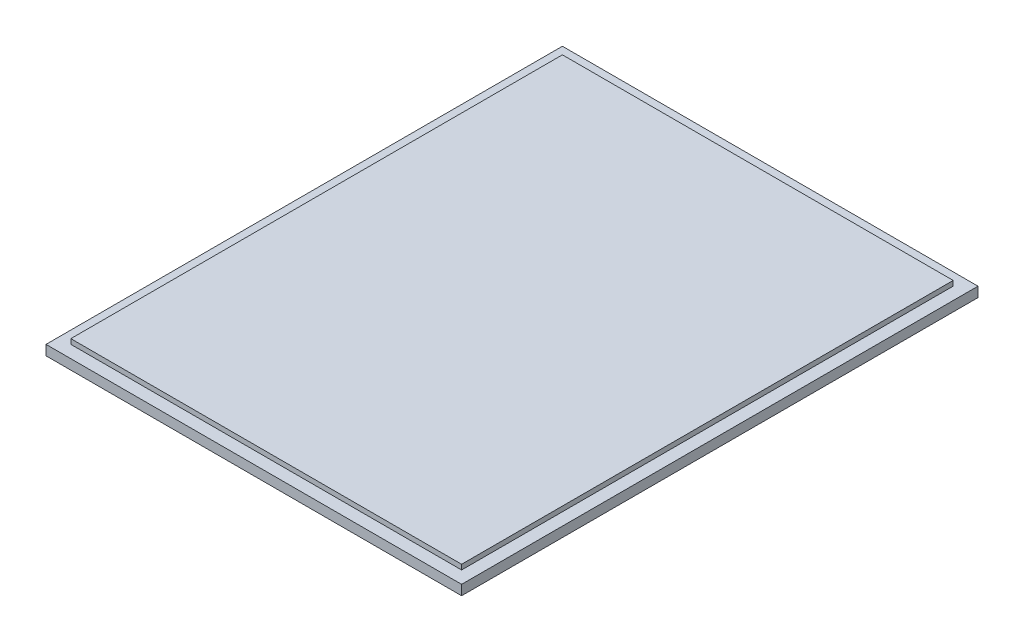
ISO-10303-21;
HEADER;
FILE_DESCRIPTION(('STEP AP214'),'2;1');
FILE_NAME('part.step','',(''),(''),'','','');
FILE_SCHEMA(('AUTOMOTIVE_DESIGN { 1 0 10303 214 1 1 1 1 }'));
ENDSEC;
DATA;
#1=APPLICATION_CONTEXT('core data for automotive mechanical design processes');
#2=APPLICATION_PROTOCOL_DEFINITION('international standard','automotive_design',2000,#1);
#3=PRODUCT_CONTEXT('',#1,'mechanical');
#4=PRODUCT('Part','Part','',(#3));
#5=PRODUCT_RELATED_PRODUCT_CATEGORY('part','',(#4));
#6=PRODUCT_DEFINITION_FORMATION('','',#4);
#7=PRODUCT_DEFINITION_CONTEXT('part definition',#1,'design');
#8=PRODUCT_DEFINITION('design','',#6,#7);
#9=PRODUCT_DEFINITION_SHAPE('','',#8);
#10=(LENGTH_UNIT() NAMED_UNIT(*) SI_UNIT(.MILLI.,.METRE.));
#11=(NAMED_UNIT(*) PLANE_ANGLE_UNIT() SI_UNIT($,.RADIAN.));
#12=(NAMED_UNIT(*) SI_UNIT($,.STERADIAN.) SOLID_ANGLE_UNIT());
#13=UNCERTAINTY_MEASURE_WITH_UNIT(LENGTH_MEASURE(1.E-05),#10,'distance_accuracy_value','');
#14=(GEOMETRIC_REPRESENTATION_CONTEXT(3) GLOBAL_UNCERTAINTY_ASSIGNED_CONTEXT((#13)) GLOBAL_UNIT_ASSIGNED_CONTEXT((#10,
#11,#12)) REPRESENTATION_CONTEXT('',''));
#15=CARTESIAN_POINT('',(0.,0.,0.));
#16=DIRECTION('',(0.,0.,1.));
#17=DIRECTION('',(1.,0.,0.));
#18=AXIS2_PLACEMENT_3D('',#15,#16,#17);
#19=CARTESIAN_POINT('',(-27.3294821104145,3.,0.));
#20=DIRECTION('',(-1.,0.,0.));
#21=DIRECTION('',(0.,0.,1.));
#22=AXIS2_PLACEMENT_3D('',#19,#20,#21);
#23=PLANE('',#22);
#24=DIRECTION('',(0.,0.,1.));
#25=VECTOR('',#24,1.);
#26=CARTESIAN_POINT('',(-27.3294821104145,2.,53.5186748205183));
#27=LINE('',#26,#25);
#28=CARTESIAN_POINT('',(-27.3294821104145,2.,-45.4813251794817));
#29=VERTEX_POINT('',#28);
#30=CARTESIAN_POINT('',(-27.3294821104145,2.,53.5186748205183));
#31=VERTEX_POINT('',#30);
#32=EDGE_CURVE('E136',#29,#31,#27,.T.);
#33=ORIENTED_EDGE('',*,*,#32,.T.);
#34=DIRECTION('',(0.,-1.,0.));
#35=VECTOR('',#34,1.);
#36=CARTESIAN_POINT('',(-27.3294821104145,3.,53.5186748205183));
#37=LINE('',#36,#35);
#38=CARTESIAN_POINT('',(-27.3294821104145,3.,53.5186748205183));
#39=VERTEX_POINT('',#38);
#40=EDGE_CURVE('E123',#39,#31,#37,.T.);
#41=ORIENTED_EDGE('',*,*,#40,.F.);
#42=DIRECTION('',(0.,0.,-1.));
#43=VECTOR('',#42,1.);
#44=CARTESIAN_POINT('',(-27.3294821104145,3.,0.));
#45=LINE('',#44,#43);
#46=CARTESIAN_POINT('',(-27.3294821104145,3.,-45.4813251794817));
#47=VERTEX_POINT('',#46);
#48=EDGE_CURVE('E133',#39,#47,#45,.T.);
#49=ORIENTED_EDGE('',*,*,#48,.T.);
#50=DIRECTION('',(0.,-1.,0.));
#51=VECTOR('',#50,1.);
#52=CARTESIAN_POINT('',(-27.3294821104145,3.,-45.4813251794817));
#53=LINE('',#52,#51);
#54=EDGE_CURVE('E132',#47,#29,#53,.T.);
#55=ORIENTED_EDGE('',*,*,#54,.T.);
#56=EDGE_LOOP('',(#33,#41,#49,#55));
#57=FACE_BOUND('',#56,.T.);
#58=ADVANCED_FACE('F57',(#57),#23,.T.);
#59=CARTESIAN_POINT('',(0.,3.,-45.4813251794817));
#60=DIRECTION('',(0.,0.,1.));
#61=DIRECTION('',(1.,0.,0.));
#62=AXIS2_PLACEMENT_3D('',#59,#60,#61);
#63=PLANE('',#62);
#64=DIRECTION('',(0.,-1.,0.));
#65=VECTOR('',#64,1.);
#66=CARTESIAN_POINT('',(51.3705178895855,3.,-45.4813251794817));
#67=LINE('',#66,#65);
#68=CARTESIAN_POINT('',(51.3705178895855,3.,-45.4813251794817));
#69=VERTEX_POINT('',#68);
#70=CARTESIAN_POINT('',(51.3705178895855,2.,-45.4813251794817));
#71=VERTEX_POINT('',#70);
#72=EDGE_CURVE('E65',#69,#71,#67,.T.);
#73=ORIENTED_EDGE('',*,*,#72,.T.);
#74=DIRECTION('',(-1.,0.,0.));
#75=VECTOR('',#74,1.);
#76=CARTESIAN_POINT('',(51.3705178895855,2.,-45.4813251794817));
#77=LINE('',#76,#75);
#78=EDGE_CURVE('E72',#71,#29,#77,.T.);
#79=ORIENTED_EDGE('',*,*,#78,.T.);
#80=ORIENTED_EDGE('',*,*,#54,.F.);
#81=DIRECTION('',(-1.,0.,0.));
#82=VECTOR('',#81,1.);
#83=CARTESIAN_POINT('',(0.,3.,-45.4813251794817));
#84=LINE('',#83,#82);
#85=EDGE_CURVE('E177',#69,#47,#84,.T.);
#86=ORIENTED_EDGE('',*,*,#85,.F.);
#87=EDGE_LOOP('',(#73,#79,#80,#86));
#88=FACE_BOUND('',#87,.T.);
#89=ADVANCED_FACE('F181',(#88),#63,.F.);
#90=CARTESIAN_POINT('',(51.3705178895855,3.,0.));
#91=DIRECTION('',(-1.,0.,0.));
#92=DIRECTION('',(0.,0.,1.));
#93=AXIS2_PLACEMENT_3D('',#90,#91,#92);
#94=PLANE('',#93);
#95=DIRECTION('',(0.,-1.,0.));
#96=VECTOR('',#95,1.);
#97=CARTESIAN_POINT('',(51.3705178895855,3.,53.5186748205183));
#98=LINE('',#97,#96);
#99=CARTESIAN_POINT('',(51.3705178895855,3.,53.5186748205183));
#100=VERTEX_POINT('',#99);
#101=CARTESIAN_POINT('',(51.3705178895855,2.,53.5186748205183));
#102=VERTEX_POINT('',#101);
#103=EDGE_CURVE('E12',#100,#102,#98,.T.);
#104=ORIENTED_EDGE('',*,*,#103,.T.);
#105=DIRECTION('',(0.,0.,-1.));
#106=VECTOR('',#105,1.);
#107=CARTESIAN_POINT('',(51.3705178895855,2.,53.5186748205183));
#108=LINE('',#107,#106);
#109=EDGE_CURVE('E79',#102,#71,#108,.T.);
#110=ORIENTED_EDGE('',*,*,#109,.T.);
#111=ORIENTED_EDGE('',*,*,#72,.F.);
#112=DIRECTION('',(0.,0.,-1.));
#113=VECTOR('',#112,1.);
#114=CARTESIAN_POINT('',(51.3705178895855,3.,0.));
#115=LINE('',#114,#113);
#116=EDGE_CURVE('E175',#100,#69,#115,.T.);
#117=ORIENTED_EDGE('',*,*,#116,.F.);
#118=EDGE_LOOP('',(#104,#110,#111,#117));
#119=FACE_BOUND('',#118,.T.);
#120=ADVANCED_FACE('F183',(#119),#94,.F.);
#121=CARTESIAN_POINT('',(0.,3.,53.5186748205183));
#122=DIRECTION('',(0.,0.,1.));
#123=DIRECTION('',(1.,0.,0.));
#124=AXIS2_PLACEMENT_3D('',#121,#122,#123);
#125=PLANE('',#124);
#126=DIRECTION('',(1.,0.,0.));
#127=VECTOR('',#126,1.);
#128=CARTESIAN_POINT('',(51.3705178895855,2.,53.5186748205183));
#129=LINE('',#128,#127);
#130=EDGE_CURVE('E126',#31,#102,#129,.T.);
#131=ORIENTED_EDGE('',*,*,#130,.T.);
#132=ORIENTED_EDGE('',*,*,#103,.F.);
#133=DIRECTION('',(-1.,0.,0.));
#134=VECTOR('',#133,1.);
#135=CARTESIAN_POINT('',(0.,3.,53.5186748205183));
#136=LINE('',#135,#134);
#137=EDGE_CURVE('E128',#100,#39,#136,.T.);
#138=ORIENTED_EDGE('',*,*,#137,.T.);
#139=ORIENTED_EDGE('',*,*,#40,.T.);
#140=EDGE_LOOP('',(#131,#132,#138,#139));
#141=FACE_BOUND('',#140,.T.);
#142=ADVANCED_FACE('F59',(#141),#125,.T.);
#143=CARTESIAN_POINT('',(0.,3.,0.));
#144=DIRECTION('',(0.,1.,0.));
#145=DIRECTION('',(0.,0.,1.));
#146=AXIS2_PLACEMENT_3D('',#143,#144,#145);
#147=PLANE('',#146);
#148=ORIENTED_EDGE('',*,*,#137,.F.);
#149=ORIENTED_EDGE('',*,*,#116,.T.);
#150=ORIENTED_EDGE('',*,*,#85,.T.);
#151=ORIENTED_EDGE('',*,*,#48,.F.);
#152=EDGE_LOOP('',(#148,#149,#150,#151));
#153=FACE_BOUND('',#152,.T.);
#154=ADVANCED_FACE('F185',(#153),#147,.T.);
#155=CARTESIAN_POINT('',(0.,2.,0.));
#156=DIRECTION('',(0.,1.,0.));
#157=DIRECTION('',(0.,0.,1.));
#158=AXIS2_PLACEMENT_3D('',#155,#156,#157);
#159=PLANE('',#158);
#160=DIRECTION('',(0.,0.,1.));
#161=VECTOR('',#160,1.);
#162=CARTESIAN_POINT('',(-29.8294821104145,2.,56.0186748205183));
#163=LINE('',#162,#161);
#164=CARTESIAN_POINT('',(-29.8294821104145,2.,-47.9813251794817));
#165=VERTEX_POINT('',#164);
#166=CARTESIAN_POINT('',(-29.8294821104145,2.,56.0186748205183));
#167=VERTEX_POINT('',#166);
#168=EDGE_CURVE('E145',#165,#167,#163,.T.);
#169=ORIENTED_EDGE('',*,*,#168,.T.);
#170=DIRECTION('',(1.,0.,0.));
#171=VECTOR('',#170,1.);
#172=CARTESIAN_POINT('',(53.8705178895855,2.,56.0186748205183));
#173=LINE('',#172,#171);
#174=CARTESIAN_POINT('',(53.8705178895855,2.,56.0186748205183));
#175=VERTEX_POINT('',#174);
#176=EDGE_CURVE('E148',#167,#175,#173,.T.);
#177=ORIENTED_EDGE('',*,*,#176,.T.);
#178=DIRECTION('',(0.,0.,-1.));
#179=VECTOR('',#178,1.);
#180=CARTESIAN_POINT('',(53.8705178895855,2.,56.0186748205183));
#181=LINE('',#180,#179);
#182=CARTESIAN_POINT('',(53.8705178895855,2.,-47.9813251794817));
#183=VERTEX_POINT('',#182);
#184=EDGE_CURVE('E151',#175,#183,#181,.T.);
#185=ORIENTED_EDGE('',*,*,#184,.T.);
#186=DIRECTION('',(-1.,0.,0.));
#187=VECTOR('',#186,1.);
#188=CARTESIAN_POINT('',(53.8705178895855,2.,-47.9813251794817));
#189=LINE('',#188,#187);
#190=EDGE_CURVE('E153',#183,#165,#189,.T.);
#191=ORIENTED_EDGE('',*,*,#190,.T.);
#192=EDGE_LOOP('',(#169,#177,#185,#191));
#193=FACE_BOUND('',#192,.T.);
#194=ORIENTED_EDGE('',*,*,#109,.F.);
#195=ORIENTED_EDGE('',*,*,#130,.F.);
#196=ORIENTED_EDGE('',*,*,#32,.F.);
#197=ORIENTED_EDGE('',*,*,#78,.F.);
#198=EDGE_LOOP('',(#194,#195,#196,#197));
#199=FACE_BOUND('',#198,.T.);
#200=ADVANCED_FACE('F140',(#193,#199),#159,.T.);
#201=CARTESIAN_POINT('',(-29.8294821104145,2.,56.0186748205183));
#202=DIRECTION('',(1.,0.,0.));
#203=DIRECTION('',(0.,0.,-1.));
#204=AXIS2_PLACEMENT_3D('',#201,#202,#203);
#205=PLANE('',#204);
#206=DIRECTION('',(0.,0.,1.));
#207=VECTOR('',#206,1.);
#208=CARTESIAN_POINT('',(-29.8294821104145,0.,56.0186748205183));
#209=LINE('',#208,#207);
#210=CARTESIAN_POINT('',(-29.8294821104145,0.,-47.9813251794817));
#211=VERTEX_POINT('',#210);
#212=CARTESIAN_POINT('',(-29.8294821104145,0.,56.0186748205183));
#213=VERTEX_POINT('',#212);
#214=EDGE_CURVE('E138',#211,#213,#209,.T.);
#215=ORIENTED_EDGE('',*,*,#214,.T.);
#216=DIRECTION('',(0.,-1.,0.));
#217=VECTOR('',#216,1.);
#218=CARTESIAN_POINT('',(-29.8294821104145,2.,56.0186748205183));
#219=LINE('',#218,#217);
#220=EDGE_CURVE('E171',#167,#213,#219,.T.);
#221=ORIENTED_EDGE('',*,*,#220,.F.);
#222=ORIENTED_EDGE('',*,*,#168,.F.);
#223=DIRECTION('',(0.,-1.,0.));
#224=VECTOR('',#223,1.);
#225=CARTESIAN_POINT('',(-29.8294821104145,2.,-47.9813251794817));
#226=LINE('',#225,#224);
#227=EDGE_CURVE('E155',#165,#211,#226,.T.);
#228=ORIENTED_EDGE('',*,*,#227,.T.);
#229=EDGE_LOOP('',(#215,#221,#222,#228));
#230=FACE_BOUND('',#229,.T.);
#231=ADVANCED_FACE('F192',(#230),#205,.F.);
#232=CARTESIAN_POINT('',(53.8705178895855,2.,56.0186748205183));
#233=DIRECTION('',(0.,0.,-1.));
#234=DIRECTION('',(-1.,0.,0.));
#235=AXIS2_PLACEMENT_3D('',#232,#233,#234);
#236=PLANE('',#235);
#237=DIRECTION('',(1.,0.,0.));
#238=VECTOR('',#237,1.);
#239=CARTESIAN_POINT('',(53.8705178895855,0.,56.0186748205183));
#240=LINE('',#239,#238);
#241=CARTESIAN_POINT('',(53.8705178895855,0.,56.0186748205183));
#242=VERTEX_POINT('',#241);
#243=EDGE_CURVE('E158',#213,#242,#240,.T.);
#244=ORIENTED_EDGE('',*,*,#243,.T.);
#245=DIRECTION('',(0.,-1.,0.));
#246=VECTOR('',#245,1.);
#247=CARTESIAN_POINT('',(53.8705178895855,2.,56.0186748205183));
#248=LINE('',#247,#246);
#249=EDGE_CURVE('E168',#175,#242,#248,.T.);
#250=ORIENTED_EDGE('',*,*,#249,.F.);
#251=ORIENTED_EDGE('',*,*,#176,.F.);
#252=ORIENTED_EDGE('',*,*,#220,.T.);
#253=EDGE_LOOP('',(#244,#250,#251,#252));
#254=FACE_BOUND('',#253,.T.);
#255=ADVANCED_FACE('F230',(#254),#236,.F.);
#256=CARTESIAN_POINT('',(53.8705178895855,2.,56.0186748205183));
#257=DIRECTION('',(-1.,0.,0.));
#258=DIRECTION('',(0.,0.,1.));
#259=AXIS2_PLACEMENT_3D('',#256,#257,#258);
#260=PLANE('',#259);
#261=DIRECTION('',(0.,0.,-1.));
#262=VECTOR('',#261,1.);
#263=CARTESIAN_POINT('',(53.8705178895855,0.,56.0186748205183));
#264=LINE('',#263,#262);
#265=CARTESIAN_POINT('',(53.8705178895855,0.,-47.9813251794817));
#266=VERTEX_POINT('',#265);
#267=EDGE_CURVE('E160',#242,#266,#264,.T.);
#268=ORIENTED_EDGE('',*,*,#267,.T.);
#269=DIRECTION('',(0.,-1.,0.));
#270=VECTOR('',#269,1.);
#271=CARTESIAN_POINT('',(53.8705178895855,2.,-47.9813251794817));
#272=LINE('',#271,#270);
#273=EDGE_CURVE('E165',#183,#266,#272,.T.);
#274=ORIENTED_EDGE('',*,*,#273,.F.);
#275=ORIENTED_EDGE('',*,*,#184,.F.);
#276=ORIENTED_EDGE('',*,*,#249,.T.);
#277=EDGE_LOOP('',(#268,#274,#275,#276));
#278=FACE_BOUND('',#277,.T.);
#279=ADVANCED_FACE('F239',(#278),#260,.F.);
#280=CARTESIAN_POINT('',(53.8705178895855,2.,-47.9813251794817));
#281=DIRECTION('',(0.,0.,1.));
#282=DIRECTION('',(1.,0.,0.));
#283=AXIS2_PLACEMENT_3D('',#280,#281,#282);
#284=PLANE('',#283);
#285=DIRECTION('',(-1.,0.,0.));
#286=VECTOR('',#285,1.);
#287=CARTESIAN_POINT('',(53.8705178895855,0.,-47.9813251794817));
#288=LINE('',#287,#286);
#289=EDGE_CURVE('E149',#266,#211,#288,.T.);
#290=ORIENTED_EDGE('',*,*,#289,.T.);
#291=ORIENTED_EDGE('',*,*,#227,.F.);
#292=ORIENTED_EDGE('',*,*,#190,.F.);
#293=ORIENTED_EDGE('',*,*,#273,.T.);
#294=EDGE_LOOP('',(#290,#291,#292,#293));
#295=FACE_BOUND('',#294,.T.);
#296=ADVANCED_FACE('F249',(#295),#284,.F.);
#297=CARTESIAN_POINT('',(0.,0.,0.));
#298=DIRECTION('',(0.,1.,0.));
#299=DIRECTION('',(0.,0.,1.));
#300=AXIS2_PLACEMENT_3D('',#297,#298,#299);
#301=PLANE('',#300);
#302=ORIENTED_EDGE('',*,*,#214,.F.);
#303=ORIENTED_EDGE('',*,*,#289,.F.);
#304=ORIENTED_EDGE('',*,*,#267,.F.);
#305=ORIENTED_EDGE('',*,*,#243,.F.);
#306=EDGE_LOOP('',(#302,#303,#304,#305));
#307=FACE_BOUND('',#306,.T.);
#308=ADVANCED_FACE('F203',(#307),#301,.F.);
#309=CLOSED_SHELL('',(#58,#89,#120,#142,#154,#200,#231,#255,#279,#296,#308));
#310=MANIFOLD_SOLID_BREP('B2',#309);
#311=ADVANCED_BREP_SHAPE_REPRESENTATION('',(#18,#310),#14);
#312=SHAPE_DEFINITION_REPRESENTATION(#9,#311);
ENDSEC;
END-ISO-10303-21;
